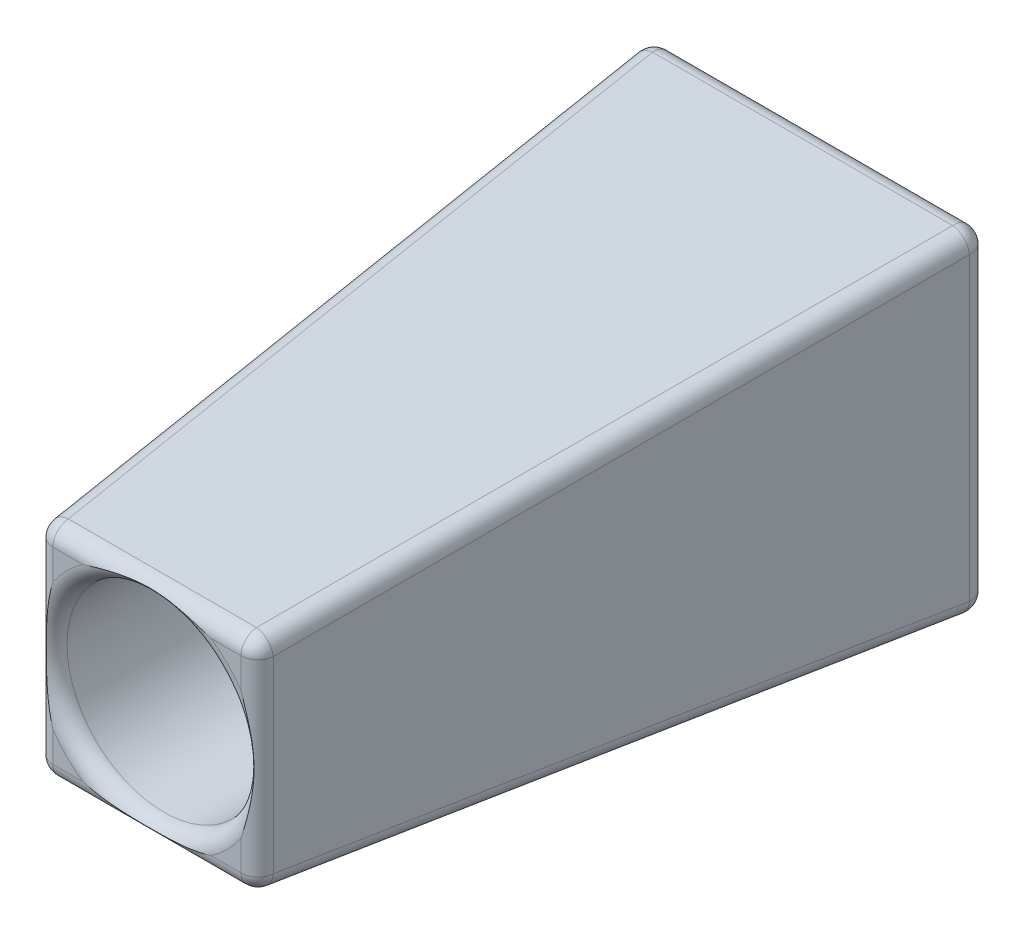
ISO-10303-21;
HEADER;
FILE_DESCRIPTION(('STEP AP214'),'2;1');
FILE_NAME('part.step','',(''),(''),'','','');
FILE_SCHEMA(('AUTOMOTIVE_DESIGN { 1 0 10303 214 1 1 1 1 }'));
ENDSEC;
DATA;
#1=APPLICATION_CONTEXT('core data for automotive mechanical design processes');
#2=APPLICATION_PROTOCOL_DEFINITION('international standard','automotive_design',2000,#1);
#3=PRODUCT_CONTEXT('',#1,'mechanical');
#4=PRODUCT('Part','Part','',(#3));
#5=PRODUCT_RELATED_PRODUCT_CATEGORY('part','',(#4));
#6=PRODUCT_DEFINITION_FORMATION('','',#4);
#7=PRODUCT_DEFINITION_CONTEXT('part definition',#1,'design');
#8=PRODUCT_DEFINITION('design','',#6,#7);
#9=PRODUCT_DEFINITION_SHAPE('','',#8);
#10=(LENGTH_UNIT() NAMED_UNIT(*) SI_UNIT(.MILLI.,.METRE.));
#11=(NAMED_UNIT(*) PLANE_ANGLE_UNIT() SI_UNIT($,.RADIAN.));
#12=(NAMED_UNIT(*) SI_UNIT($,.STERADIAN.) SOLID_ANGLE_UNIT());
#13=UNCERTAINTY_MEASURE_WITH_UNIT(LENGTH_MEASURE(1.E-05),#10,'distance_accuracy_value','');
#14=(GEOMETRIC_REPRESENTATION_CONTEXT(3) GLOBAL_UNCERTAINTY_ASSIGNED_CONTEXT((#13)) GLOBAL_UNIT_ASSIGNED_CONTEXT((#10,
#11,#12)) REPRESENTATION_CONTEXT('',''));
#15=CARTESIAN_POINT('',(0.,0.,0.));
#16=DIRECTION('',(0.,0.,1.));
#17=DIRECTION('',(1.,0.,0.));
#18=AXIS2_PLACEMENT_3D('',#15,#16,#17);
#19=CARTESIAN_POINT('',(0.,0.,20.));
#20=DIRECTION('',(0.,0.,1.));
#21=DIRECTION('',(1.,0.,0.));
#22=AXIS2_PLACEMENT_3D('',#19,#20,#21);
#23=PLANE('',#22);
#24=CARTESIAN_POINT('',(0.,0.,20.));
#25=DIRECTION('',(0.,0.,1.));
#26=DIRECTION('',(1.,0.,0.));
#27=AXIS2_PLACEMENT_3D('',#24,#25,#26);
#28=CIRCLE('',#27,3.375);
#29=CARTESIAN_POINT('',(1.89637989850939,2.79183958717715,20.));
#30=VERTEX_POINT('',#29);
#31=CARTESIAN_POINT('',(2.79183958717716,1.89637989850939,20.));
#32=VERTEX_POINT('',#31);
#33=EDGE_CURVE('E216',#30,#32,#28,.F.);
#34=ORIENTED_EDGE('',*,*,#33,.T.);
#35=DIRECTION('',(0.,1.,0.));
#36=VECTOR('',#35,1.);
#37=CARTESIAN_POINT('',(2.79183958717716,3.25,20.));
#38=LINE('',#37,#36);
#39=CARTESIAN_POINT('',(2.79183958717716,2.79183958717715,20.));
#40=VERTEX_POINT('',#39);
#41=EDGE_CURVE('E220',#32,#40,#38,.T.);
#42=ORIENTED_EDGE('',*,*,#41,.T.);
#43=DIRECTION('',(1.,0.,0.));
#44=VECTOR('',#43,1.);
#45=CARTESIAN_POINT('',(-3.25,2.79183958717715,20.));
#46=LINE('',#45,#44);
#47=EDGE_CURVE('E218',#40,#30,#46,.F.);
#48=ORIENTED_EDGE('',*,*,#47,.T.);
#49=EDGE_LOOP('',(#34,#42,#48));
#50=FACE_BOUND('',#49,.T.);
#51=ADVANCED_FACE('F33',(#50),#23,.T.);
#52=DIRECTION('',(1.,0.,0.));
#53=VECTOR('',#52,1.);
#54=CARTESIAN_POINT('',(3.25000000000001,-2.79183958717715,20.));
#55=LINE('',#54,#53);
#56=CARTESIAN_POINT('',(1.89637989850939,-2.79183958717716,20.));
#57=VERTEX_POINT('',#56);
#58=CARTESIAN_POINT('',(2.79183958717716,-2.79183958717715,20.));
#59=VERTEX_POINT('',#58);
#60=EDGE_CURVE('E211',#57,#59,#55,.T.);
#61=ORIENTED_EDGE('',*,*,#60,.T.);
#62=DIRECTION('',(0.,1.,0.));
#63=VECTOR('',#62,1.);
#64=CARTESIAN_POINT('',(2.79183958717716,3.25,20.));
#65=LINE('',#64,#63);
#66=CARTESIAN_POINT('',(2.79183958717716,-1.89637989850939,20.));
#67=VERTEX_POINT('',#66);
#68=EDGE_CURVE('E213',#59,#67,#65,.T.);
#69=ORIENTED_EDGE('',*,*,#68,.T.);
#70=CARTESIAN_POINT('',(0.,0.,20.));
#71=DIRECTION('',(0.,0.,1.));
#72=DIRECTION('',(1.,0.,0.));
#73=AXIS2_PLACEMENT_3D('',#70,#71,#72);
#74=CIRCLE('',#73,3.375);
#75=EDGE_CURVE('E209',#67,#57,#74,.F.);
#76=ORIENTED_EDGE('',*,*,#75,.T.);
#77=EDGE_LOOP('',(#61,#69,#76));
#78=FACE_BOUND('',#77,.T.);
#79=ADVANCED_FACE('F396',(#78),#23,.T.);
#80=DIRECTION('',(0.,1.,0.));
#81=VECTOR('',#80,1.);
#82=CARTESIAN_POINT('',(-2.79183958717715,-3.25,20.));
#83=LINE('',#82,#81);
#84=CARTESIAN_POINT('',(-2.79183958717715,-1.89637989850939,20.));
#85=VERTEX_POINT('',#84);
#86=CARTESIAN_POINT('',(-2.79183958717715,-2.79183958717716,20.));
#87=VERTEX_POINT('',#86);
#88=EDGE_CURVE('E204',#85,#87,#83,.F.);
#89=ORIENTED_EDGE('',*,*,#88,.T.);
#90=DIRECTION('',(1.,0.,0.));
#91=VECTOR('',#90,1.);
#92=CARTESIAN_POINT('',(3.25000000000001,-2.79183958717715,20.));
#93=LINE('',#92,#91);
#94=CARTESIAN_POINT('',(-1.89637989850939,-2.79183958717716,20.));
#95=VERTEX_POINT('',#94);
#96=EDGE_CURVE('E206',#87,#95,#93,.T.);
#97=ORIENTED_EDGE('',*,*,#96,.T.);
#98=CARTESIAN_POINT('',(0.,0.,20.));
#99=DIRECTION('',(0.,0.,1.));
#100=DIRECTION('',(1.,0.,0.));
#101=AXIS2_PLACEMENT_3D('',#98,#99,#100);
#102=CIRCLE('',#101,3.375);
#103=EDGE_CURVE('E202',#95,#85,#102,.F.);
#104=ORIENTED_EDGE('',*,*,#103,.T.);
#105=EDGE_LOOP('',(#89,#97,#104));
#106=FACE_BOUND('',#105,.T.);
#107=ADVANCED_FACE('F403',(#106),#23,.T.);
#108=DIRECTION('',(1.,0.,0.));
#109=VECTOR('',#108,1.);
#110=CARTESIAN_POINT('',(-3.25,2.79183958717715,20.));
#111=LINE('',#110,#109);
#112=CARTESIAN_POINT('',(-1.89637989850939,2.79183958717715,20.));
#113=VERTEX_POINT('',#112);
#114=CARTESIAN_POINT('',(-2.79183958717715,2.79183958717715,20.));
#115=VERTEX_POINT('',#114);
#116=EDGE_CURVE('E197',#113,#115,#111,.F.);
#117=ORIENTED_EDGE('',*,*,#116,.T.);
#118=DIRECTION('',(0.,1.,0.));
#119=VECTOR('',#118,1.);
#120=CARTESIAN_POINT('',(-2.79183958717715,-3.25,20.));
#121=LINE('',#120,#119);
#122=CARTESIAN_POINT('',(-2.79183958717715,1.89637989850939,20.));
#123=VERTEX_POINT('',#122);
#124=EDGE_CURVE('E199',#115,#123,#121,.F.);
#125=ORIENTED_EDGE('',*,*,#124,.T.);
#126=CARTESIAN_POINT('',(0.,0.,20.));
#127=DIRECTION('',(0.,0.,1.));
#128=DIRECTION('',(1.,0.,0.));
#129=AXIS2_PLACEMENT_3D('',#126,#127,#128);
#130=CIRCLE('',#129,3.375);
#131=EDGE_CURVE('E195',#123,#113,#130,.F.);
#132=ORIENTED_EDGE('',*,*,#131,.T.);
#133=EDGE_LOOP('',(#117,#125,#132));
#134=FACE_BOUND('',#133,.T.);
#135=ADVANCED_FACE('F399',(#134),#23,.T.);
#136=CARTESIAN_POINT('',(0.,0.,0.));
#137=DIRECTION('',(0.,0.,1.));
#138=DIRECTION('',(1.,0.,0.));
#139=AXIS2_PLACEMENT_3D('',#136,#137,#138);
#140=PLANE('',#139);
#141=DIRECTION('',(-1.,0.,0.));
#142=VECTOR('',#141,1.);
#143=CARTESIAN_POINT('',(0.,4.45433958717715,0.));
#144=LINE('',#143,#142);
#145=CARTESIAN_POINT('',(-4.45433958717715,4.45433958717715,0.));
#146=VERTEX_POINT('',#145);
#147=CARTESIAN_POINT('',(4.45433958717715,4.45433958717715,0.));
#148=VERTEX_POINT('',#147);
#149=EDGE_CURVE('E185',#146,#148,#144,.F.);
#150=ORIENTED_EDGE('',*,*,#149,.T.);
#151=DIRECTION('',(0.,1.,0.));
#152=VECTOR('',#151,1.);
#153=CARTESIAN_POINT('',(4.45433958717715,0.,0.));
#154=LINE('',#153,#152);
#155=CARTESIAN_POINT('',(4.45433958717715,-4.45433958717715,0.));
#156=VERTEX_POINT('',#155);
#157=EDGE_CURVE('E155',#148,#156,#154,.F.);
#158=ORIENTED_EDGE('',*,*,#157,.T.);
#159=DIRECTION('',(1.,0.,0.));
#160=VECTOR('',#159,1.);
#161=CARTESIAN_POINT('',(0.,-4.45433958717715,0.));
#162=LINE('',#161,#160);
#163=CARTESIAN_POINT('',(-4.45433958717715,-4.45433958717716,0.));
#164=VERTEX_POINT('',#163);
#165=EDGE_CURVE('E192',#156,#164,#162,.F.);
#166=ORIENTED_EDGE('',*,*,#165,.T.);
#167=DIRECTION('',(0.,-1.,0.));
#168=VECTOR('',#167,1.);
#169=CARTESIAN_POINT('',(-4.45433958717715,0.,0.));
#170=LINE('',#169,#168);
#171=EDGE_CURVE('E190',#164,#146,#170,.F.);
#172=ORIENTED_EDGE('',*,*,#171,.T.);
#173=EDGE_LOOP('',(#150,#158,#166,#172));
#174=FACE_BOUND('',#173,.T.);
#175=ADVANCED_FACE('F408',(#174),#140,.F.);
#176=CARTESIAN_POINT('',(-25.0764165129139,-5.,0.));
#177=DIRECTION('',(0.,0.996193717496113,-0.0871669502809099));
#178=DIRECTION('',(0.,0.0871669502809099,0.996193717496113));
#179=AXIS2_PLACEMENT_3D('',#176,#177,#178);
#180=PLANE('',#179);
#181=DIRECTION('',(1.,0.,0.));
#182=VECTOR('',#181,1.);
#183=CARTESIAN_POINT('',(-25.0764165129139,-4.95243644592521,0.543583475140455));
#184=LINE('',#183,#182);
#185=CARTESIAN_POINT('',(-4.45433958717715,-4.95243644592521,0.543583475140455));
#186=VERTEX_POINT('',#185);
#187=CARTESIAN_POINT('',(4.45433958717715,-4.95243644592521,0.543583475140455));
#188=VERTEX_POINT('',#187);
#189=EDGE_CURVE('E227',#186,#188,#184,.T.);
#190=ORIENTED_EDGE('',*,*,#189,.T.);
#191=DIRECTION('',(0.0868376748825581,-0.0868376748825584,-0.992430570086383));
#192=VECTOR('',#191,1.);
#193=CARTESIAN_POINT('',(4.2788594873501,-4.77695634609817,2.54907033030667));
#194=LINE('',#193,#192);
#195=CARTESIAN_POINT('',(2.79183958717716,-3.28993644592521,19.5435834751405));
#196=VERTEX_POINT('',#195);
#197=EDGE_CURVE('E229',#188,#196,#194,.F.);
#198=ORIENTED_EDGE('',*,*,#197,.T.);
#199=DIRECTION('',(1.,0.,0.));
#200=VECTOR('',#199,1.);
#201=CARTESIAN_POINT('',(-3.25,-3.28993644592521,19.5435834751405));
#202=LINE('',#201,#200);
#203=CARTESIAN_POINT('',(-2.79183958717715,-3.28993644592521,19.5435834751405));
#204=VERTEX_POINT('',#203);
#205=EDGE_CURVE('E225',#196,#204,#202,.F.);
#206=ORIENTED_EDGE('',*,*,#205,.T.);
#207=DIRECTION('',(0.0868376748825585,0.0868376748825585,0.992430570086383));
#208=VECTOR('',#207,1.);
#209=CARTESIAN_POINT('',(-4.65705105679695,-5.155147915545,-1.77311903480004));
#210=LINE('',#209,#208);
#211=EDGE_CURVE('E223',#204,#186,#210,.F.);
#212=ORIENTED_EDGE('',*,*,#211,.T.);
#213=EDGE_LOOP('',(#190,#198,#206,#212));
#214=FACE_BOUND('',#213,.T.);
#215=ADVANCED_FACE('F372',(#214),#180,.F.);
#216=CARTESIAN_POINT('',(-25.0764165129139,5.,0.));
#217=DIRECTION('',(0.,-0.996193717496113,-0.0871669502809099));
#218=DIRECTION('',(0.,0.0871669502809099,-0.996193717496113));
#219=AXIS2_PLACEMENT_3D('',#216,#217,#218);
#220=PLANE('',#219);
#221=DIRECTION('',(1.,0.,0.));
#222=VECTOR('',#221,1.);
#223=CARTESIAN_POINT('',(3.25000000000001,3.28993644592521,19.5435834751405));
#224=LINE('',#223,#222);
#225=CARTESIAN_POINT('',(-2.79183958717715,3.28993644592521,19.5435834751405));
#226=VERTEX_POINT('',#225);
#227=CARTESIAN_POINT('',(2.79183958717716,3.28993644592521,19.5435834751405));
#228=VERTEX_POINT('',#227);
#229=EDGE_CURVE('E50',#226,#228,#224,.T.);
#230=ORIENTED_EDGE('',*,*,#229,.T.);
#231=DIRECTION('',(0.0868376748825581,0.0868376748825585,-0.992430570086383));
#232=VECTOR('',#231,1.);
#233=CARTESIAN_POINT('',(4.27885948735011,4.77695634609817,2.54907033030668));
#234=LINE('',#233,#232);
#235=CARTESIAN_POINT('',(4.45433958717715,4.95243644592521,0.543583475140455));
#236=VERTEX_POINT('',#235);
#237=EDGE_CURVE('E42',#228,#236,#234,.T.);
#238=ORIENTED_EDGE('',*,*,#237,.T.);
#239=DIRECTION('',(-1.,0.,0.));
#240=VECTOR('',#239,1.);
#241=CARTESIAN_POINT('',(-25.0764165129139,4.95243644592521,0.543583475140455));
#242=LINE('',#241,#240);
#243=CARTESIAN_POINT('',(-4.45433958717715,4.95243644592521,0.543583475140455));
#244=VERTEX_POINT('',#243);
#245=EDGE_CURVE('E241',#236,#244,#242,.T.);
#246=ORIENTED_EDGE('',*,*,#245,.T.);
#247=DIRECTION('',(0.0868376748825585,-0.0868376748825584,0.992430570086383));
#248=VECTOR('',#247,1.);
#249=CARTESIAN_POINT('',(-4.65705105679695,5.155147915545,-1.77311903480004));
#250=LINE('',#249,#248);
#251=EDGE_CURVE('E55',#244,#226,#250,.T.);
#252=ORIENTED_EDGE('',*,*,#251,.T.);
#253=EDGE_LOOP('',(#230,#238,#246,#252));
#254=FACE_BOUND('',#253,.T.);
#255=ADVANCED_FACE('F430',(#254),#220,.F.);
#256=CARTESIAN_POINT('',(5.,-24.2397707564569,0.));
#257=DIRECTION('',(-0.996193717496113,0.,-0.0871669502809095));
#258=DIRECTION('',(-0.0871669502809095,0.,0.996193717496113));
#259=AXIS2_PLACEMENT_3D('',#256,#257,#258);
#260=PLANE('',#259);
#261=DIRECTION('',(0.,1.,0.));
#262=VECTOR('',#261,1.);
#263=CARTESIAN_POINT('',(3.28993644592522,-3.25,19.5435834751405));
#264=LINE('',#263,#262);
#265=CARTESIAN_POINT('',(3.28993644592522,2.79183958717715,19.5435834751405));
#266=VERTEX_POINT('',#265);
#267=CARTESIAN_POINT('',(3.28993644592522,-2.79183958717715,19.5435834751405));
#268=VERTEX_POINT('',#267);
#269=EDGE_CURVE('E177',#266,#268,#264,.F.);
#270=ORIENTED_EDGE('',*,*,#269,.T.);
#271=DIRECTION('',(0.0868376748825581,-0.0868376748825585,-0.992430570086383));
#272=VECTOR('',#271,1.);
#273=CARTESIAN_POINT('',(5.14883895246923,-4.65074209372118,-1.70101659964832));
#274=LINE('',#273,#272);
#275=CARTESIAN_POINT('',(4.95243644592521,-4.45433958717715,0.543583475140455));
#276=VERTEX_POINT('',#275);
#277=EDGE_CURVE('E182',#268,#276,#274,.T.);
#278=ORIENTED_EDGE('',*,*,#277,.T.);
#279=DIRECTION('',(0.,1.,0.));
#280=VECTOR('',#279,1.);
#281=CARTESIAN_POINT('',(4.95243644592521,-24.2397707564569,0.543583475140455));
#282=LINE('',#281,#280);
#283=CARTESIAN_POINT('',(4.95243644592521,4.45433958717715,0.543583475140455));
#284=VERTEX_POINT('',#283);
#285=EDGE_CURVE('E153',#276,#284,#282,.T.);
#286=ORIENTED_EDGE('',*,*,#285,.T.);
#287=DIRECTION('',(0.0868376748825581,0.0868376748825585,-0.992430570086383));
#288=VECTOR('',#287,1.);
#289=CARTESIAN_POINT('',(4.78326530917394,4.28516845042588,2.47696789515497));
#290=LINE('',#289,#288);
#291=EDGE_CURVE('E171',#284,#266,#290,.F.);
#292=ORIENTED_EDGE('',*,*,#291,.T.);
#293=EDGE_LOOP('',(#270,#278,#286,#292));
#294=FACE_BOUND('',#293,.T.);
#295=ADVANCED_FACE('F180',(#294),#260,.F.);
#296=CARTESIAN_POINT('',(-5.,-24.2397707564569,0.));
#297=DIRECTION('',(0.996193717496113,0.,-0.0871669502809099));
#298=DIRECTION('',(-0.0871669502809099,0.,-0.996193717496113));
#299=AXIS2_PLACEMENT_3D('',#296,#297,#298);
#300=PLANE('',#299);
#301=DIRECTION('',(0.0868376748825584,0.0868376748825585,0.992430570086382));
#302=VECTOR('',#301,1.);
#303=CARTESIAN_POINT('',(-5.14883895246923,-4.65074209372118,-1.70101659964832));
#304=LINE('',#303,#302);
#305=CARTESIAN_POINT('',(-4.95243644592521,-4.45433958717716,0.543583475140455));
#306=VERTEX_POINT('',#305);
#307=CARTESIAN_POINT('',(-3.28993644592521,-2.79183958717716,19.5435834751405));
#308=VERTEX_POINT('',#307);
#309=EDGE_CURVE('E236',#306,#308,#304,.T.);
#310=ORIENTED_EDGE('',*,*,#309,.T.);
#311=DIRECTION('',(0.,1.,0.));
#312=VECTOR('',#311,1.);
#313=CARTESIAN_POINT('',(-3.28993644592521,3.25,19.5435834751405));
#314=LINE('',#313,#312);
#315=CARTESIAN_POINT('',(-3.28993644592521,2.79183958717715,19.5435834751405));
#316=VERTEX_POINT('',#315);
#317=EDGE_CURVE('E238',#308,#316,#314,.T.);
#318=ORIENTED_EDGE('',*,*,#317,.T.);
#319=DIRECTION('',(0.0868376748825584,-0.0868376748825584,0.992430570086382));
#320=VECTOR('',#319,1.);
#321=CARTESIAN_POINT('',(-4.78326530917394,4.28516845042589,2.47696789515497));
#322=LINE('',#321,#320);
#323=CARTESIAN_POINT('',(-4.95243644592521,4.45433958717715,0.543583475140455));
#324=VERTEX_POINT('',#323);
#325=EDGE_CURVE('E232',#316,#324,#322,.F.);
#326=ORIENTED_EDGE('',*,*,#325,.T.);
#327=DIRECTION('',(0.,-1.,0.));
#328=VECTOR('',#327,1.);
#329=CARTESIAN_POINT('',(-4.95243644592521,-24.2397707564569,0.543583475140455));
#330=LINE('',#329,#328);
#331=EDGE_CURVE('E234',#324,#306,#330,.T.);
#332=ORIENTED_EDGE('',*,*,#331,.T.);
#333=EDGE_LOOP('',(#310,#318,#326,#332));
#334=FACE_BOUND('',#333,.T.);
#335=ADVANCED_FACE('F445',(#334),#300,.F.);
#336=CARTESIAN_POINT('',(0.,0.,5.));
#337=DIRECTION('',(0.,0.,1.));
#338=DIRECTION('',(1.,0.,0.));
#339=AXIS2_PLACEMENT_3D('',#336,#337,#338);
#340=CYLINDRICAL_SURFACE('',#339,2.875);
#341=CARTESIAN_POINT('',(0.,0.,19.5));
#342=DIRECTION('',(0.,0.,1.));
#343=DIRECTION('',(1.,0.,0.));
#344=AXIS2_PLACEMENT_3D('',#341,#342,#343);
#345=CIRCLE('',#344,2.875);
#346=CARTESIAN_POINT('',(2.875,0.,19.5));
#347=VERTEX_POINT('',#346);
#348=EDGE_CURVE('E11',#347,#347,#345,.T.);
#349=ORIENTED_EDGE('',*,*,#348,.T.);
#350=EDGE_LOOP('',(#349));
#351=FACE_BOUND('',#350,.T.);
#352=CARTESIAN_POINT('',(0.,0.,5.));
#353=DIRECTION('',(0.,0.,1.));
#354=DIRECTION('',(1.,0.,0.));
#355=AXIS2_PLACEMENT_3D('',#352,#353,#354);
#356=CIRCLE('',#355,2.875);
#357=CARTESIAN_POINT('',(2.875,0.,5.));
#358=VERTEX_POINT('',#357);
#359=EDGE_CURVE('E178',#358,#358,#356,.T.);
#360=ORIENTED_EDGE('',*,*,#359,.F.);
#361=EDGE_LOOP('',(#360));
#362=FACE_BOUND('',#361,.T.);
#363=ADVANCED_FACE('F451',(#351,#362),#340,.F.);
#364=CARTESIAN_POINT('',(0.,0.,5.));
#365=DIRECTION('',(0.,0.,1.));
#366=DIRECTION('',(1.,0.,0.));
#367=AXIS2_PLACEMENT_3D('',#364,#365,#366);
#368=PLANE('',#367);
#369=ORIENTED_EDGE('',*,*,#359,.T.);
#370=EDGE_LOOP('',(#369));
#371=FACE_BOUND('',#370,.T.);
#372=ADVANCED_FACE('F344',(#371),#368,.T.);
#373=CARTESIAN_POINT('',(-2.79183958717715,-24.2397707564569,19.5));
#374=DIRECTION('',(0.,-1.,0.));
#375=DIRECTION('',(0.,0.,-1.));
#376=AXIS2_PLACEMENT_3D('',#373,#374,#375);
#377=CYLINDRICAL_SURFACE('',#376,0.5);
#378=CARTESIAN_POINT('',(-2.79183958717715,-2.79183958717716,19.5));
#379=DIRECTION('',(0.,-1.,0.));
#380=DIRECTION('',(1.,0.,0.));
#381=AXIS2_PLACEMENT_3D('',#378,#379,#380);
#382=CIRCLE('',#381,0.5);
#383=EDGE_CURVE('E37',#87,#308,#382,.T.);
#384=ORIENTED_EDGE('',*,*,#383,.F.);
#385=ORIENTED_EDGE('',*,*,#88,.F.);
#386=CARTESIAN_POINT('',(-2.79183958717715,-1.89637989850939,20.));
#387=CARTESIAN_POINT('',(-2.79242412078823,-1.89447905607036,19.9999999944078));
#388=CARTESIAN_POINT('',(-2.79300785239372,-1.89257796059131,19.9999989696428));
#389=CARTESIAN_POINT('',(-2.81811787336542,-1.81067621961241,19.9999112535938));
#390=CARTESIAN_POINT('',(-2.84122334475387,-1.73023029151943,19.9980347471211));
#391=CARTESIAN_POINT('',(-2.88444696361123,-1.56863022730708,19.9918331824864));
#392=CARTESIAN_POINT('',(-2.90456428627033,-1.48747590217156,19.9875074498515));
#393=CARTESIAN_POINT('',(-2.94173999032462,-1.32442014501787,19.9773905017742));
#394=CARTESIAN_POINT('',(-2.95879333449393,-1.24251771118937,19.9715969101554));
#395=CARTESIAN_POINT('',(-2.98972232678927,-1.07814480608748,19.9594746967437));
#396=CARTESIAN_POINT('',(-3.00359722710026,-0.995674205829282,19.9531459495195));
#397=CARTESIAN_POINT('',(-3.03852778580295,-0.759695583545342,19.9356578616844));
#398=CARTESIAN_POINT('',(-3.05563071030367,-0.605524748649749,19.9249765184991));
#399=CARTESIAN_POINT('',(-3.07259825473313,-0.373447881156277,19.9137836367165));
#400=CARTESIAN_POINT('',(-3.076806301926,-0.295955688910347,19.9108575548379));
#401=CARTESIAN_POINT('',(-3.08229962392756,-0.14081542769692,19.9069957673149));
#402=CARTESIAN_POINT('',(-3.08358504931976,-0.0631673669666326,19.9060599591249));
#403=CARTESIAN_POINT('',(-3.08322055689755,0.0921194051923151,19.906321456505));
#404=CARTESIAN_POINT('',(-3.08157058952678,0.169758116441005,19.9075187980878));
#405=CARTESIAN_POINT('',(-3.07535111989695,0.324860783720639,19.9118669465742));
#406=CARTESIAN_POINT('',(-3.07078145874075,0.40232473001016,19.9150178597957));
#407=CARTESIAN_POINT('',(-3.05273682586426,0.634296209168199,19.9267847550704));
#408=CARTESIAN_POINT('',(-3.03492624698324,0.788369368237421,19.9377147420966));
#409=CARTESIAN_POINT('',(-2.99929158360208,1.02179848002779,19.955132371898));
#410=CARTESIAN_POINT('',(-2.98550243571888,1.10183996741963,19.9612605363689));
#411=CARTESIAN_POINT('',(-2.95493192910822,1.26138214540435,19.9729373728047));
#412=CARTESIAN_POINT('',(-2.93815129116855,1.34088296149013,19.9784861838528));
#413=CARTESIAN_POINT('',(-2.9017013213763,1.49917071562593,19.9881446509587));
#414=CARTESIAN_POINT('',(-2.88203672992105,1.57795860409897,19.9922566319364));
#415=CARTESIAN_POINT('',(-2.83989150625425,1.73486311649082,19.9981408625345));
#416=CARTESIAN_POINT('',(-2.81741159459155,1.81297990672235,19.9999137094948));
#417=CARTESIAN_POINT('',(-2.79300785238824,1.89257796050014,19.9999989699139));
#418=CARTESIAN_POINT('',(-2.79242412077557,1.89447905598157,19.9999999946874));
#419=CARTESIAN_POINT('',(-2.79183958717715,1.89637989850939,20.));
#420=B_SPLINE_CURVE_WITH_KNOTS('',3,(#386,#387,#388,#389,#390,#391,#392,#393,#394,#395,#396,
#397,#398,#399,#400,#401,#402,#403,#404,#405,#406,#407,#408,#409,#410,#411,#412,#413,#414,#415,
#416,#417,#418,#419),.UNSPECIFIED.,.F.,.F.,(4,2,2,2,2,2,2,2,2,2,2,2,2,2,2,2,4),(0.,
0.00596608327478894,0.256992842693485,0.508088764030127,0.7595937870354,1.01115792277542,
1.47703780208351,1.70995661754529,1.94286343195867,2.17577417842666,2.40869760156762,
2.87458635135655,3.11890272467229,3.36316031028442,3.60702081479804,3.85081903308173,
3.85678511635849),.UNSPECIFIED.);
#421=EDGE_CURVE('E347',#123,#85,#420,.F.);
#422=ORIENTED_EDGE('',*,*,#421,.F.);
#423=ORIENTED_EDGE('',*,*,#124,.F.);
#424=CARTESIAN_POINT('',(-2.79183958717715,2.79183958717715,19.5));
#425=DIRECTION('',(0.,1.,0.));
#426=DIRECTION('',(0.,0.,1.));
#427=AXIS2_PLACEMENT_3D('',#424,#425,#426);
#428=CIRCLE('',#427,0.5);
#429=EDGE_CURVE('E354',#316,#115,#428,.T.);
#430=ORIENTED_EDGE('',*,*,#429,.F.);
#431=ORIENTED_EDGE('',*,*,#317,.F.);
#432=EDGE_LOOP('',(#384,#385,#422,#423,#430,#431));
#433=FACE_BOUND('',#432,.T.);
#434=ADVANCED_FACE('F341',(#433),#377,.T.);
#435=CARTESIAN_POINT('',(-2.79183958717715,-2.79183958717716,19.5));
#436=DIRECTION('',(0.,0.,1.));
#437=DIRECTION('',(1.,0.,0.));
#438=AXIS2_PLACEMENT_3D('',#435,#436,#437);
#439=SPHERICAL_SURFACE('',#438,0.5);
#440=CARTESIAN_POINT('',(-2.79183958717715,-2.79183958717715,19.5));
#441=DIRECTION('',(-1.,0.,0.));
#442=DIRECTION('',(0.,0.,1.));
#443=AXIS2_PLACEMENT_3D('',#440,#441,#442);
#444=CIRCLE('',#443,0.5);
#445=EDGE_CURVE('E324',#87,#204,#444,.F.);
#446=ORIENTED_EDGE('',*,*,#445,.F.);
#447=ORIENTED_EDGE('',*,*,#383,.T.);
#448=CARTESIAN_POINT('',(-2.79183958717715,-2.79183958717716,19.5));
#449=DIRECTION('',(0.0868376748825577,0.0868376748825585,0.992430570086382));
#450=DIRECTION('',(0.,-0.996193717496113,0.0871669502809099));
#451=AXIS2_PLACEMENT_3D('',#448,#449,#450);
#452=CIRCLE('',#451,0.5);
#453=EDGE_CURVE('E356',#204,#308,#452,.F.);
#454=ORIENTED_EDGE('',*,*,#453,.F.);
#455=EDGE_LOOP('',(#446,#447,#454));
#456=FACE_BOUND('',#455,.T.);
#457=ADVANCED_FACE('F35',(#456),#439,.T.);
#458=CARTESIAN_POINT('',(0.,0.,19.5));
#459=DIRECTION('',(0.,0.,1.));
#460=DIRECTION('',(1.,0.,0.));
#461=AXIS2_PLACEMENT_3D('',#458,#459,#460);
#462=TOROIDAL_SURFACE('',#461,3.375,0.5);
#463=ORIENTED_EDGE('',*,*,#348,.F.);
#464=EDGE_LOOP('',(#463));
#465=FACE_BOUND('',#464,.T.);
#466=ORIENTED_EDGE('',*,*,#421,.T.);
#467=ORIENTED_EDGE('',*,*,#103,.F.);
#468=CARTESIAN_POINT('',(1.89637989850939,-2.79183958717715,20.));
#469=CARTESIAN_POINT('',(1.89447905607036,-2.79242412078823,19.9999999944078));
#470=CARTESIAN_POINT('',(1.89257796059131,-2.79300785239372,19.9999989696428));
#471=CARTESIAN_POINT('',(1.81067621961241,-2.81811787336542,19.9999112535938));
#472=CARTESIAN_POINT('',(1.73023029151943,-2.84122334475387,19.9980347471211));
#473=CARTESIAN_POINT('',(1.56863022730708,-2.88444696361123,19.9918331824864));
#474=CARTESIAN_POINT('',(1.48747590217156,-2.90456428627033,19.9875074498515));
#475=CARTESIAN_POINT('',(1.32442014501787,-2.94173999032462,19.9773905017742));
#476=CARTESIAN_POINT('',(1.24251771118937,-2.95879333449394,19.9715969101554));
#477=CARTESIAN_POINT('',(1.07814480608748,-2.98972232678927,19.9594746967437));
#478=CARTESIAN_POINT('',(0.995674205829284,-3.00359722710026,19.9531459495195));
#479=CARTESIAN_POINT('',(0.759695583545347,-3.03852778580295,19.9356578616844));
#480=CARTESIAN_POINT('',(0.605524748649757,-3.05563071030367,19.9249765184991));
#481=CARTESIAN_POINT('',(0.373447881156289,-3.07259825473313,19.9137836367165));
#482=CARTESIAN_POINT('',(0.29595568891036,-3.076806301926,19.9108575548379));
#483=CARTESIAN_POINT('',(0.140815427696934,-3.08229962392756,19.9069957673149));
#484=CARTESIAN_POINT('',(0.0631673669666483,-3.08358504931976,19.9060599591249));
#485=CARTESIAN_POINT('',(-0.0921194051923006,-3.08322055689755,19.906321456505));
#486=CARTESIAN_POINT('',(-0.169758116440992,-3.08157058952678,19.9075187980878));
#487=CARTESIAN_POINT('',(-0.32486078372063,-3.07535111989695,19.9118669465742));
#488=CARTESIAN_POINT('',(-0.402324730010154,-3.07078145874076,19.9150178597957));
#489=CARTESIAN_POINT('',(-0.634296209168198,-3.05273682586426,19.9267847550704));
#490=CARTESIAN_POINT('',(-0.788369368237423,-3.03492624698324,19.9377147420966));
#491=CARTESIAN_POINT('',(-1.02179848002779,-2.99929158360208,19.955132371898));
#492=CARTESIAN_POINT('',(-1.10183996741964,-2.98550243571888,19.9612605363689));
#493=CARTESIAN_POINT('',(-1.26138214540436,-2.95493192910822,19.9729373728047));
#494=CARTESIAN_POINT('',(-1.34088296149014,-2.93815129116855,19.9784861838528));
#495=CARTESIAN_POINT('',(-1.49917071562594,-2.9017013213763,19.9881446509587));
#496=CARTESIAN_POINT('',(-1.57795860409897,-2.88203672992103,19.9922566319364));
#497=CARTESIAN_POINT('',(-1.73486311649082,-2.83989150625426,19.9981408625345));
#498=CARTESIAN_POINT('',(-1.81297990672237,-2.8174115945916,19.9999137094948));
#499=CARTESIAN_POINT('',(-1.89257796050014,-2.79300785238825,19.9999989699139));
#500=CARTESIAN_POINT('',(-1.89447905598157,-2.79242412077557,19.9999999946874));
#501=CARTESIAN_POINT('',(-1.89637989850939,-2.79183958717716,20.));
#502=B_SPLINE_CURVE_WITH_KNOTS('',3,(#468,#469,#470,#471,#472,#473,#474,#475,#476,#477,#478,
#479,#480,#481,#482,#483,#484,#485,#486,#487,#488,#489,#490,#491,#492,#493,#494,#495,#496,#497,
#498,#499,#500,#501),.UNSPECIFIED.,.F.,.F.,(4,2,2,2,2,2,2,2,2,2,2,2,2,2,2,2,4),(0.,
0.00596608327478894,0.256992842693486,0.508088764030128,0.759593787035399,1.01115792277542,
1.4770378020835,1.70995661754528,1.94286343195865,2.17577417842665,2.40869760156761,
2.87458635135656,3.1189027246723,3.36316031028443,3.60702081479805,3.85081903308172,
3.85678511635849),.UNSPECIFIED.);
#503=EDGE_CURVE('E317',#57,#95,#502,.T.);
#504=ORIENTED_EDGE('',*,*,#503,.F.);
#505=ORIENTED_EDGE('',*,*,#75,.F.);
#506=CARTESIAN_POINT('',(2.79183958717716,1.89637989850939,20.));
#507=CARTESIAN_POINT('',(2.79242412078824,1.89447905607036,19.9999999944078));
#508=CARTESIAN_POINT('',(2.79300785239372,1.8925779605913,19.9999989696428));
#509=CARTESIAN_POINT('',(2.81811787336542,1.8106762196124,19.9999112535938));
#510=CARTESIAN_POINT('',(2.84122334475387,1.73023029151943,19.9980347471211));
#511=CARTESIAN_POINT('',(2.88444696361123,1.56863022730708,19.9918331824864));
#512=CARTESIAN_POINT('',(2.90456428627034,1.48747590217156,19.9875074498515));
#513=CARTESIAN_POINT('',(2.94173999032463,1.32442014501787,19.9773905017742));
#514=CARTESIAN_POINT('',(2.95879333449394,1.24251771118937,19.9715969101554));
#515=CARTESIAN_POINT('',(2.98972232678927,1.07814480608747,19.9594746967437));
#516=CARTESIAN_POINT('',(3.00359722710027,0.995674205829277,19.9531459495195));
#517=CARTESIAN_POINT('',(3.03852778580296,0.759695583545331,19.9356578616844));
#518=CARTESIAN_POINT('',(3.05563071030368,0.605524748649733,19.9249765184991));
#519=CARTESIAN_POINT('',(3.07259825473314,0.373447881156253,19.9137836367165));
#520=CARTESIAN_POINT('',(3.076806301926,0.295955688910321,19.9108575548379));
#521=CARTESIAN_POINT('',(3.08229962392757,0.140815427696889,19.9069957673149));
#522=CARTESIAN_POINT('',(3.08358504931976,0.0631673669665996,19.9060599591249));
#523=CARTESIAN_POINT('',(3.08322055689755,-0.0921194051923478,19.906321456505));
#524=CARTESIAN_POINT('',(3.08157058952678,-0.169758116441035,19.9075187980878));
#525=CARTESIAN_POINT('',(3.07535111989695,-0.324860783720664,19.9118669465742));
#526=CARTESIAN_POINT('',(3.07078145874076,-0.402324730010183,19.9150178597957));
#527=CARTESIAN_POINT('',(3.05273682586426,-0.634296209168217,19.9267847550704));
#528=CARTESIAN_POINT('',(3.03492624698324,-0.788369368237435,19.9377147420966));
#529=CARTESIAN_POINT('',(2.99929158360208,-1.0217984800278,19.955132371898));
#530=CARTESIAN_POINT('',(2.98550243571888,-1.10183996741964,19.9612605363689));
#531=CARTESIAN_POINT('',(2.95493192910822,-1.26138214540435,19.9729373728047));
#532=CARTESIAN_POINT('',(2.93815129116855,-1.34088296149012,19.9784861838528));
#533=CARTESIAN_POINT('',(2.90170132137631,-1.49917071562593,19.9881446509587));
#534=CARTESIAN_POINT('',(2.88203672992107,-1.57795860409896,19.9922566319364));
#535=CARTESIAN_POINT('',(2.83989150625423,-1.7348631164908,19.9981408625345));
#536=CARTESIAN_POINT('',(2.81741159459148,-1.81297990672232,19.9999137094948));
#537=CARTESIAN_POINT('',(2.79300785238825,-1.89257796050013,19.9999989699139));
#538=CARTESIAN_POINT('',(2.79242412077557,-1.89447905598156,19.9999999946874));
#539=CARTESIAN_POINT('',(2.79183958717716,-1.89637989850939,20.));
#540=B_SPLINE_CURVE_WITH_KNOTS('',3,(#506,#507,#508,#509,#510,#511,#512,#513,#514,#515,#516,
#517,#518,#519,#520,#521,#522,#523,#524,#525,#526,#527,#528,#529,#530,#531,#532,#533,#534,#535,
#536,#537,#538,#539),.UNSPECIFIED.,.F.,.F.,(4,2,2,2,2,2,2,2,2,2,2,2,2,2,2,2,4),(0.,
0.00596608327478894,0.256992842693483,0.508088764030122,0.759593787035395,1.01115792277542,
1.47703780208352,1.70995661754531,1.94286343195869,2.17577417842668,2.40869760156763,
2.87458635135656,3.11890272467229,3.3631603102844,3.60702081479802,3.85081903308171,
3.85678511635848),.UNSPECIFIED.);
#541=EDGE_CURVE('E299',#32,#67,#540,.T.);
#542=ORIENTED_EDGE('',*,*,#541,.F.);
#543=ORIENTED_EDGE('',*,*,#33,.F.);
#544=CARTESIAN_POINT('',(-1.89637989850939,2.79183958717715,20.));
#545=CARTESIAN_POINT('',(-1.89447905607037,2.79242412078823,19.9999999944078));
#546=CARTESIAN_POINT('',(-1.89257796059131,2.79300785239372,19.9999989696428));
#547=CARTESIAN_POINT('',(-1.81067621961241,2.81811787336542,19.9999112535938));
#548=CARTESIAN_POINT('',(-1.73023029151944,2.84122334475387,19.9980347471211));
#549=CARTESIAN_POINT('',(-1.56863022730708,2.88444696361123,19.9918331824864));
#550=CARTESIAN_POINT('',(-1.48747590217156,2.90456428627033,19.9875074498515));
#551=CARTESIAN_POINT('',(-1.32442014501787,2.94173999032462,19.9773905017742));
#552=CARTESIAN_POINT('',(-1.24251771118938,2.95879333449393,19.9715969101554));
#553=CARTESIAN_POINT('',(-1.07814480608748,2.98972232678927,19.9594746967437));
#554=CARTESIAN_POINT('',(-0.995674205829285,3.00359722710026,19.9531459495195));
#555=CARTESIAN_POINT('',(-0.759695583545341,3.03852778580295,19.9356578616844));
#556=CARTESIAN_POINT('',(-0.605524748649745,3.05563071030367,19.9249765184991));
#557=CARTESIAN_POINT('',(-0.373447881156268,3.07259825473313,19.9137836367165));
#558=CARTESIAN_POINT('',(-0.295955688910337,3.076806301926,19.9108575548379));
#559=CARTESIAN_POINT('',(-0.140815427696907,3.08229962392756,19.9069957673149));
#560=CARTESIAN_POINT('',(-0.0631673669666189,3.08358504931976,19.9060599591249));
#561=CARTESIAN_POINT('',(0.0921194051923281,3.08322055689755,19.906321456505));
#562=CARTESIAN_POINT('',(0.169758116441016,3.08157058952678,19.9075187980878));
#563=CARTESIAN_POINT('',(0.324860783720646,3.07535111989695,19.9118669465742));
#564=CARTESIAN_POINT('',(0.402324730010166,3.07078145874075,19.9150178597957));
#565=CARTESIAN_POINT('',(0.634296209168201,3.05273682586426,19.9267847550704));
#566=CARTESIAN_POINT('',(0.78836936823742,3.03492624698324,19.9377147420966));
#567=CARTESIAN_POINT('',(1.02179848002779,2.99929158360208,19.955132371898));
#568=CARTESIAN_POINT('',(1.10183996741963,2.98550243571888,19.9612605363689));
#569=CARTESIAN_POINT('',(1.26138214540435,2.95493192910822,19.9729373728047));
#570=CARTESIAN_POINT('',(1.34088296149012,2.93815129116855,19.9784861838528));
#571=CARTESIAN_POINT('',(1.49917071562593,2.90170132137631,19.9881446509587));
#572=CARTESIAN_POINT('',(1.57795860409896,2.88203672992106,19.9922566319364));
#573=CARTESIAN_POINT('',(1.73486311649081,2.83989150625423,19.9981408625345));
#574=CARTESIAN_POINT('',(1.81297990672234,2.8174115945915,19.9999137094948));
#575=CARTESIAN_POINT('',(1.89257796050014,2.79300785238824,19.9999989699139));
#576=CARTESIAN_POINT('',(1.89447905598157,2.79242412077556,19.9999999946874));
#577=CARTESIAN_POINT('',(1.89637989850939,2.79183958717715,20.));
#578=B_SPLINE_CURVE_WITH_KNOTS('',3,(#544,#545,#546,#547,#548,#549,#550,#551,#552,#553,#554,
#555,#556,#557,#558,#559,#560,#561,#562,#563,#564,#565,#566,#567,#568,#569,#570,#571,#572,#573,
#574,#575,#576,#577),.UNSPECIFIED.,.F.,.F.,(4,2,2,2,2,2,2,2,2,2,2,2,2,2,2,2,4),(0.,
0.00596608327478894,0.256992842693484,0.508088764030125,0.759593787035398,1.01115792277542,
1.47703780208352,1.70995661754531,1.94286343195868,2.17577417842667,2.40869760156762,
2.87458635135655,3.11890272467229,3.36316031028441,3.60702081479804,3.85081903308173,
3.8567851163585),.UNSPECIFIED.);
#579=EDGE_CURVE('E290',#113,#30,#578,.T.);
#580=ORIENTED_EDGE('',*,*,#579,.F.);
#581=ORIENTED_EDGE('',*,*,#131,.F.);
#582=EDGE_LOOP('',(#466,#467,#504,#505,#542,#543,#580,#581));
#583=FACE_BOUND('',#582,.T.);
#584=ADVANCED_FACE('F308',(#465,#583),#462,.T.);
#585=CARTESIAN_POINT('',(-2.79183958717715,2.79183958717715,19.5));
#586=DIRECTION('',(0.,0.,1.));
#587=DIRECTION('',(0.,-1.,0.));
#588=AXIS2_PLACEMENT_3D('',#585,#586,#587);
#589=SPHERICAL_SURFACE('',#588,0.5);
#590=CARTESIAN_POINT('',(-2.79183958717715,2.79183958717715,19.5));
#591=DIRECTION('',(0.0868376748825576,-0.0868376748825578,0.992430570086383));
#592=DIRECTION('',(0.,-0.996193717496113,-0.0871669502809091));
#593=AXIS2_PLACEMENT_3D('',#590,#591,#592);
#594=CIRCLE('',#593,0.5);
#595=EDGE_CURVE('E285',#316,#226,#594,.F.);
#596=ORIENTED_EDGE('',*,*,#595,.F.);
#597=ORIENTED_EDGE('',*,*,#429,.T.);
#598=CARTESIAN_POINT('',(-2.79183958717715,2.79183958717715,19.5));
#599=DIRECTION('',(-1.,0.,0.));
#600=DIRECTION('',(0.,0.,1.));
#601=AXIS2_PLACEMENT_3D('',#598,#599,#600);
#602=CIRCLE('',#601,0.5);
#603=EDGE_CURVE('E287',#226,#115,#602,.F.);
#604=ORIENTED_EDGE('',*,*,#603,.F.);
#605=EDGE_LOOP('',(#596,#597,#604));
#606=FACE_BOUND('',#605,.T.);
#607=ADVANCED_FACE('F312',(#606),#589,.T.);
#608=CARTESIAN_POINT('',(-4.65074209372117,-4.65074209372118,-1.74460007478878));
#609=DIRECTION('',(0.0868376748825585,0.0868376748825585,0.992430570086382));
#610=DIRECTION('',(0.,-0.996193717496113,0.0871669502809099));
#611=AXIS2_PLACEMENT_3D('',#608,#609,#610);
#612=CYLINDRICAL_SURFACE('',#611,0.5);
#613=ORIENTED_EDGE('',*,*,#453,.T.);
#614=ORIENTED_EDGE('',*,*,#309,.F.);
#615=CARTESIAN_POINT('',(-4.45433958717715,-4.45433958717716,0.5));
#616=DIRECTION('',(-0.0868376748825578,-0.0868376748825584,-0.992430570086383));
#617=DIRECTION('',(0.,0.996193717496113,-0.0871669502809099));
#618=AXIS2_PLACEMENT_3D('',#615,#616,#617);
#619=CIRCLE('',#618,0.5);
#620=EDGE_CURVE('E279',#186,#306,#619,.T.);
#621=ORIENTED_EDGE('',*,*,#620,.F.);
#622=ORIENTED_EDGE('',*,*,#211,.F.);
#623=EDGE_LOOP('',(#613,#614,#621,#622));
#624=FACE_BOUND('',#623,.T.);
#625=ADVANCED_FACE('F333',(#624),#612,.T.);
#626=CARTESIAN_POINT('',(0.,-2.79183958717716,19.5));
#627=DIRECTION('',(-1.,0.,0.));
#628=DIRECTION('',(0.,-1.,0.));
#629=AXIS2_PLACEMENT_3D('',#626,#627,#628);
#630=CYLINDRICAL_SURFACE('',#629,0.5);
#631=ORIENTED_EDGE('',*,*,#445,.T.);
#632=ORIENTED_EDGE('',*,*,#205,.F.);
#633=CARTESIAN_POINT('',(2.79183958717716,-2.79183958717715,19.5));
#634=DIRECTION('',(1.,0.,0.));
#635=DIRECTION('',(0.,1.,0.));
#636=AXIS2_PLACEMENT_3D('',#633,#634,#635);
#637=CIRCLE('',#636,0.5);
#638=EDGE_CURVE('E276',#59,#196,#637,.T.);
#639=ORIENTED_EDGE('',*,*,#638,.F.);
#640=ORIENTED_EDGE('',*,*,#60,.F.);
#641=ORIENTED_EDGE('',*,*,#503,.T.);
#642=ORIENTED_EDGE('',*,*,#96,.F.);
#643=EDGE_LOOP('',(#631,#632,#639,#640,#641,#642));
#644=FACE_BOUND('',#643,.T.);
#645=ADVANCED_FACE('F330',(#644),#630,.T.);
#646=CARTESIAN_POINT('',(2.79183958717716,0.,19.5));
#647=DIRECTION('',(0.,-1.,0.));
#648=DIRECTION('',(0.,0.,-1.));
#649=AXIS2_PLACEMENT_3D('',#646,#647,#648);
#650=CYLINDRICAL_SURFACE('',#649,0.5);
#651=ORIENTED_EDGE('',*,*,#541,.T.);
#652=ORIENTED_EDGE('',*,*,#68,.F.);
#653=CARTESIAN_POINT('',(2.79183958717716,-2.79183958717715,19.5));
#654=DIRECTION('',(0.,-1.,0.));
#655=DIRECTION('',(0.,0.,-1.));
#656=AXIS2_PLACEMENT_3D('',#653,#654,#655);
#657=CIRCLE('',#656,0.5);
#658=EDGE_CURVE('E273',#268,#59,#657,.T.);
#659=ORIENTED_EDGE('',*,*,#658,.F.);
#660=ORIENTED_EDGE('',*,*,#269,.F.);
#661=CARTESIAN_POINT('',(2.79183958717716,2.79183958717715,19.5));
#662=DIRECTION('',(0.,1.,0.));
#663=DIRECTION('',(-1.,0.,0.));
#664=AXIS2_PLACEMENT_3D('',#661,#662,#663);
#665=CIRCLE('',#664,0.5);
#666=EDGE_CURVE('E270',#40,#266,#665,.T.);
#667=ORIENTED_EDGE('',*,*,#666,.F.);
#668=ORIENTED_EDGE('',*,*,#41,.F.);
#669=EDGE_LOOP('',(#651,#652,#659,#660,#667,#668));
#670=FACE_BOUND('',#669,.T.);
#671=ADVANCED_FACE('F329',(#670),#650,.T.);
#672=CARTESIAN_POINT('',(-25.0764165129139,2.79183958717715,19.5));
#673=DIRECTION('',(-1.,0.,0.));
#674=DIRECTION('',(0.,-1.,0.));
#675=AXIS2_PLACEMENT_3D('',#672,#673,#674);
#676=CYLINDRICAL_SURFACE('',#675,0.5);
#677=ORIENTED_EDGE('',*,*,#579,.T.);
#678=ORIENTED_EDGE('',*,*,#47,.F.);
#679=CARTESIAN_POINT('',(2.79183958717716,2.79183958717715,19.5));
#680=DIRECTION('',(1.,0.,0.));
#681=DIRECTION('',(0.,0.,-1.));
#682=AXIS2_PLACEMENT_3D('',#679,#680,#681);
#683=CIRCLE('',#682,0.5);
#684=EDGE_CURVE('E268',#228,#40,#683,.T.);
#685=ORIENTED_EDGE('',*,*,#684,.F.);
#686=ORIENTED_EDGE('',*,*,#229,.F.);
#687=ORIENTED_EDGE('',*,*,#603,.T.);
#688=ORIENTED_EDGE('',*,*,#116,.F.);
#689=EDGE_LOOP('',(#677,#678,#685,#686,#687,#688));
#690=FACE_BOUND('',#689,.T.);
#691=ADVANCED_FACE('F314',(#690),#676,.T.);
#692=CARTESIAN_POINT('',(-4.65705105679695,4.65705105679695,-1.8167025099405));
#693=DIRECTION('',(0.0868376748825585,-0.0868376748825584,0.992430570086382));
#694=DIRECTION('',(0.996193717496113,0.,-0.0871669502809099));
#695=AXIS2_PLACEMENT_3D('',#692,#693,#694);
#696=CYLINDRICAL_SURFACE('',#695,0.5);
#697=ORIENTED_EDGE('',*,*,#595,.T.);
#698=ORIENTED_EDGE('',*,*,#251,.F.);
#699=CARTESIAN_POINT('',(-4.45433958717715,4.45433958717715,0.5));
#700=DIRECTION('',(-0.0868376748825583,0.0868376748825581,-0.992430570086383));
#701=DIRECTION('',(-0.996193717496113,0.,0.0871669502809097));
#702=AXIS2_PLACEMENT_3D('',#699,#700,#701);
#703=CIRCLE('',#702,0.5);
#704=EDGE_CURVE('E265',#324,#244,#703,.T.);
#705=ORIENTED_EDGE('',*,*,#704,.F.);
#706=ORIENTED_EDGE('',*,*,#325,.F.);
#707=EDGE_LOOP('',(#697,#698,#705,#706));
#708=FACE_BOUND('',#707,.T.);
#709=ADVANCED_FACE('F433',(#708),#696,.T.);
#710=CARTESIAN_POINT('',(-4.45433958717715,-24.2397707564569,0.5));
#711=DIRECTION('',(0.,-1.,0.));
#712=DIRECTION('',(0.,0.,-1.));
#713=AXIS2_PLACEMENT_3D('',#710,#711,#712);
#714=CYLINDRICAL_SURFACE('',#713,0.5);
#715=CARTESIAN_POINT('',(-4.45433958717715,-4.45433958717716,0.5));
#716=DIRECTION('',(0.,-1.,0.));
#717=DIRECTION('',(0.,0.,-1.));
#718=AXIS2_PLACEMENT_3D('',#715,#716,#717);
#719=CIRCLE('',#718,0.5);
#720=EDGE_CURVE('E282',#306,#164,#719,.T.);
#721=ORIENTED_EDGE('',*,*,#720,.F.);
#722=ORIENTED_EDGE('',*,*,#331,.F.);
#723=CARTESIAN_POINT('',(-4.45433958717715,4.45433958717715,0.5));
#724=DIRECTION('',(0.,1.,0.));
#725=DIRECTION('',(-1.,0.,0.));
#726=AXIS2_PLACEMENT_3D('',#723,#724,#725);
#727=CIRCLE('',#726,0.5);
#728=EDGE_CURVE('E262',#146,#324,#727,.T.);
#729=ORIENTED_EDGE('',*,*,#728,.F.);
#730=ORIENTED_EDGE('',*,*,#171,.F.);
#731=EDGE_LOOP('',(#721,#722,#729,#730));
#732=FACE_BOUND('',#731,.T.);
#733=ADVANCED_FACE('F443',(#732),#714,.T.);
#734=CARTESIAN_POINT('',(-4.45433958717715,-4.45433958717716,0.5));
#735=DIRECTION('',(0.,0.,-1.));
#736=DIRECTION('',(-1.,0.,0.));
#737=AXIS2_PLACEMENT_3D('',#734,#735,#736);
#738=SPHERICAL_SURFACE('',#737,0.5);
#739=ORIENTED_EDGE('',*,*,#620,.T.);
#740=ORIENTED_EDGE('',*,*,#720,.T.);
#741=CARTESIAN_POINT('',(-4.45433958717715,-4.45433958717716,0.5));
#742=DIRECTION('',(-1.,0.,0.));
#743=DIRECTION('',(0.,-1.,0.));
#744=AXIS2_PLACEMENT_3D('',#741,#742,#743);
#745=CIRCLE('',#744,0.5);
#746=EDGE_CURVE('E259',#186,#164,#745,.F.);
#747=ORIENTED_EDGE('',*,*,#746,.F.);
#748=EDGE_LOOP('',(#739,#740,#747));
#749=FACE_BOUND('',#748,.T.);
#750=ADVANCED_FACE('F556',(#749),#738,.T.);
#751=CARTESIAN_POINT('',(2.79183958717716,-2.79183958717715,19.5));
#752=DIRECTION('',(0.,0.,1.));
#753=DIRECTION('',(1.,0.,0.));
#754=AXIS2_PLACEMENT_3D('',#751,#752,#753);
#755=SPHERICAL_SURFACE('',#754,0.5);
#756=ORIENTED_EDGE('',*,*,#658,.T.);
#757=ORIENTED_EDGE('',*,*,#638,.T.);
#758=CARTESIAN_POINT('',(2.79183958717716,-2.79183958717715,19.5));
#759=DIRECTION('',(-0.0868376748825577,0.0868376748825577,0.992430570086383));
#760=DIRECTION('',(0.,-0.996193717496113,0.0871669502809092));
#761=AXIS2_PLACEMENT_3D('',#758,#759,#760);
#762=CIRCLE('',#761,0.5);
#763=EDGE_CURVE('E257',#268,#196,#762,.F.);
#764=ORIENTED_EDGE('',*,*,#763,.F.);
#765=EDGE_LOOP('',(#756,#757,#764));
#766=FACE_BOUND('',#765,.T.);
#767=ADVANCED_FACE('F565',(#766),#755,.T.);
#768=CARTESIAN_POINT('',(2.79183958717716,2.79183958717715,19.5));
#769=DIRECTION('',(0.,0.,1.));
#770=DIRECTION('',(1.,0.,0.));
#771=AXIS2_PLACEMENT_3D('',#768,#769,#770);
#772=SPHERICAL_SURFACE('',#771,0.5);
#773=ORIENTED_EDGE('',*,*,#684,.T.);
#774=ORIENTED_EDGE('',*,*,#666,.T.);
#775=CARTESIAN_POINT('',(2.79183958717716,2.79183958717715,19.5));
#776=DIRECTION('',(-0.0868376748825577,-0.0868376748825575,0.992430570086383));
#777=DIRECTION('',(0.996193717496113,0.,0.0871669502809092));
#778=AXIS2_PLACEMENT_3D('',#775,#776,#777);
#779=CIRCLE('',#778,0.5);
#780=EDGE_CURVE('E174',#228,#266,#779,.F.);
#781=ORIENTED_EDGE('',*,*,#780,.F.);
#782=EDGE_LOOP('',(#773,#774,#781));
#783=FACE_BOUND('',#782,.T.);
#784=ADVANCED_FACE('F429',(#783),#772,.T.);
#785=CARTESIAN_POINT('',(-4.45433958717715,4.45433958717715,0.5));
#786=DIRECTION('',(0.,0.,-1.));
#787=DIRECTION('',(-1.,0.,0.));
#788=AXIS2_PLACEMENT_3D('',#785,#786,#787);
#789=SPHERICAL_SURFACE('',#788,0.5);
#790=ORIENTED_EDGE('',*,*,#728,.T.);
#791=ORIENTED_EDGE('',*,*,#704,.T.);
#792=CARTESIAN_POINT('',(-4.45433958717715,4.45433958717715,0.5));
#793=DIRECTION('',(-1.,0.,0.));
#794=DIRECTION('',(0.,0.,1.));
#795=AXIS2_PLACEMENT_3D('',#792,#793,#794);
#796=CIRCLE('',#795,0.5);
#797=EDGE_CURVE('E253',#146,#244,#796,.F.);
#798=ORIENTED_EDGE('',*,*,#797,.F.);
#799=EDGE_LOOP('',(#790,#791,#798));
#800=FACE_BOUND('',#799,.T.);
#801=ADVANCED_FACE('F436',(#800),#789,.T.);
#802=CARTESIAN_POINT('',(-25.0764165129139,-4.45433958717716,0.5));
#803=DIRECTION('',(1.,0.,0.));
#804=DIRECTION('',(0.,1.,0.));
#805=AXIS2_PLACEMENT_3D('',#802,#803,#804);
#806=CYLINDRICAL_SURFACE('',#805,0.5);
#807=ORIENTED_EDGE('',*,*,#746,.T.);
#808=ORIENTED_EDGE('',*,*,#165,.F.);
#809=CARTESIAN_POINT('',(4.45433958717715,-4.45433958717715,0.5));
#810=DIRECTION('',(1.,0.,0.));
#811=DIRECTION('',(0.,0.,-1.));
#812=AXIS2_PLACEMENT_3D('',#809,#810,#811);
#813=CIRCLE('',#812,0.5);
#814=EDGE_CURVE('E250',#188,#156,#813,.T.);
#815=ORIENTED_EDGE('',*,*,#814,.F.);
#816=ORIENTED_EDGE('',*,*,#189,.F.);
#817=EDGE_LOOP('',(#807,#808,#815,#816));
#818=FACE_BOUND('',#817,.T.);
#819=ADVANCED_FACE('F382',(#818),#806,.T.);
#820=CARTESIAN_POINT('',(4.65074209372117,-4.65074209372117,-1.74460007478878));
#821=DIRECTION('',(0.0868376748825581,-0.0868376748825584,-0.992430570086382));
#822=DIRECTION('',(0.,0.996193717496113,-0.0871669502809099));
#823=AXIS2_PLACEMENT_3D('',#820,#821,#822);
#824=CYLINDRICAL_SURFACE('',#823,0.5);
#825=ORIENTED_EDGE('',*,*,#763,.T.);
#826=ORIENTED_EDGE('',*,*,#197,.F.);
#827=CARTESIAN_POINT('',(4.45433958717715,-4.45433958717715,0.5));
#828=DIRECTION('',(0.0868376748825581,-0.0868376748825585,-0.992430570086382));
#829=DIRECTION('',(0.,0.996193717496113,-0.0871669502809099));
#830=AXIS2_PLACEMENT_3D('',#827,#828,#829);
#831=CIRCLE('',#830,0.5);
#832=EDGE_CURVE('E168',#276,#188,#831,.T.);
#833=ORIENTED_EDGE('',*,*,#832,.F.);
#834=ORIENTED_EDGE('',*,*,#277,.F.);
#835=EDGE_LOOP('',(#825,#826,#833,#834));
#836=FACE_BOUND('',#835,.T.);
#837=ADVANCED_FACE('F377',(#836),#824,.T.);
#838=CARTESIAN_POINT('',(4.27885948735011,4.27885948735011,2.50548685516622));
#839=DIRECTION('',(0.0868376748825581,0.0868376748825585,-0.992430570086382));
#840=DIRECTION('',(0.,0.996193717496113,0.0871669502809099));
#841=AXIS2_PLACEMENT_3D('',#838,#839,#840);
#842=CYLINDRICAL_SURFACE('',#841,0.5);
#843=ORIENTED_EDGE('',*,*,#780,.T.);
#844=ORIENTED_EDGE('',*,*,#291,.F.);
#845=CARTESIAN_POINT('',(4.45433958717715,4.45433958717715,0.5));
#846=DIRECTION('',(0.0868376748825587,0.0868376748825584,-0.992430570086382));
#847=DIRECTION('',(-0.996193717496113,0.,-0.0871669502809101));
#848=AXIS2_PLACEMENT_3D('',#845,#846,#847);
#849=CIRCLE('',#848,0.5);
#850=EDGE_CURVE('E160',#236,#284,#849,.T.);
#851=ORIENTED_EDGE('',*,*,#850,.F.);
#852=ORIENTED_EDGE('',*,*,#237,.F.);
#853=EDGE_LOOP('',(#843,#844,#851,#852));
#854=FACE_BOUND('',#853,.T.);
#855=ADVANCED_FACE('F172',(#854),#842,.T.);
#856=CARTESIAN_POINT('',(-25.0764165129139,4.45433958717715,0.5));
#857=DIRECTION('',(-1.,0.,0.));
#858=DIRECTION('',(0.,-1.,0.));
#859=AXIS2_PLACEMENT_3D('',#856,#857,#858);
#860=CYLINDRICAL_SURFACE('',#859,0.5);
#861=ORIENTED_EDGE('',*,*,#797,.T.);
#862=ORIENTED_EDGE('',*,*,#245,.F.);
#863=CARTESIAN_POINT('',(4.45433958717715,4.45433958717715,0.5));
#864=DIRECTION('',(1.,0.,0.));
#865=DIRECTION('',(0.,1.,0.));
#866=AXIS2_PLACEMENT_3D('',#863,#864,#865);
#867=CIRCLE('',#866,0.5);
#868=EDGE_CURVE('E164',#148,#236,#867,.T.);
#869=ORIENTED_EDGE('',*,*,#868,.F.);
#870=ORIENTED_EDGE('',*,*,#149,.F.);
#871=EDGE_LOOP('',(#861,#862,#869,#870));
#872=FACE_BOUND('',#871,.T.);
#873=ADVANCED_FACE('F386',(#872),#860,.T.);
#874=CARTESIAN_POINT('',(4.45433958717715,-4.45433958717715,0.5));
#875=DIRECTION('',(0.,0.,-1.));
#876=DIRECTION('',(-1.,0.,0.));
#877=AXIS2_PLACEMENT_3D('',#874,#875,#876);
#878=SPHERICAL_SURFACE('',#877,0.5);
#879=ORIENTED_EDGE('',*,*,#832,.T.);
#880=ORIENTED_EDGE('',*,*,#814,.T.);
#881=CARTESIAN_POINT('',(4.45433958717715,-4.45433958717715,0.5));
#882=DIRECTION('',(0.,-1.,0.));
#883=DIRECTION('',(0.,0.,-1.));
#884=AXIS2_PLACEMENT_3D('',#881,#882,#883);
#885=CIRCLE('',#884,0.5);
#886=EDGE_CURVE('E157',#276,#156,#885,.F.);
#887=ORIENTED_EDGE('',*,*,#886,.F.);
#888=EDGE_LOOP('',(#879,#880,#887));
#889=FACE_BOUND('',#888,.T.);
#890=ADVANCED_FACE('F384',(#889),#878,.T.);
#891=CARTESIAN_POINT('',(4.45433958717715,4.45433958717715,0.5));
#892=DIRECTION('',(0.,0.,-1.));
#893=DIRECTION('',(-1.,0.,0.));
#894=AXIS2_PLACEMENT_3D('',#891,#892,#893);
#895=SPHERICAL_SURFACE('',#894,0.5);
#896=ORIENTED_EDGE('',*,*,#868,.T.);
#897=ORIENTED_EDGE('',*,*,#850,.T.);
#898=CARTESIAN_POINT('',(4.45433958717715,4.45433958717715,0.5));
#899=DIRECTION('',(0.,1.,0.));
#900=DIRECTION('',(0.,0.,1.));
#901=AXIS2_PLACEMENT_3D('',#898,#899,#900);
#902=CIRCLE('',#901,0.5);
#903=EDGE_CURVE('E149',#148,#284,#902,.F.);
#904=ORIENTED_EDGE('',*,*,#903,.F.);
#905=EDGE_LOOP('',(#896,#897,#904));
#906=FACE_BOUND('',#905,.T.);
#907=ADVANCED_FACE('F162',(#906),#895,.T.);
#908=CARTESIAN_POINT('',(4.45433958717715,-24.2397707564569,0.5));
#909=DIRECTION('',(0.,1.,0.));
#910=DIRECTION('',(0.,0.,1.));
#911=AXIS2_PLACEMENT_3D('',#908,#909,#910);
#912=CYLINDRICAL_SURFACE('',#911,0.5);
#913=ORIENTED_EDGE('',*,*,#886,.T.);
#914=ORIENTED_EDGE('',*,*,#157,.F.);
#915=ORIENTED_EDGE('',*,*,#903,.T.);
#916=ORIENTED_EDGE('',*,*,#285,.F.);
#917=EDGE_LOOP('',(#913,#914,#915,#916));
#918=FACE_BOUND('',#917,.T.);
#919=ADVANCED_FACE('F151',(#918),#912,.T.);
#920=CLOSED_SHELL('',(#51,#79,#107,#135,#175,#215,#255,#295,#335,#363,#372,#434,#457,#584,#607,
#625,#645,#671,#691,#709,#733,#750,#767,#784,#801,#819,#837,#855,#873,#890,#907,#919));
#921=MANIFOLD_SOLID_BREP('B2',#920);
#922=ADVANCED_BREP_SHAPE_REPRESENTATION('',(#18,#921),#14);
#923=SHAPE_DEFINITION_REPRESENTATION(#9,#922);
ENDSEC;
END-ISO-10303-21;
